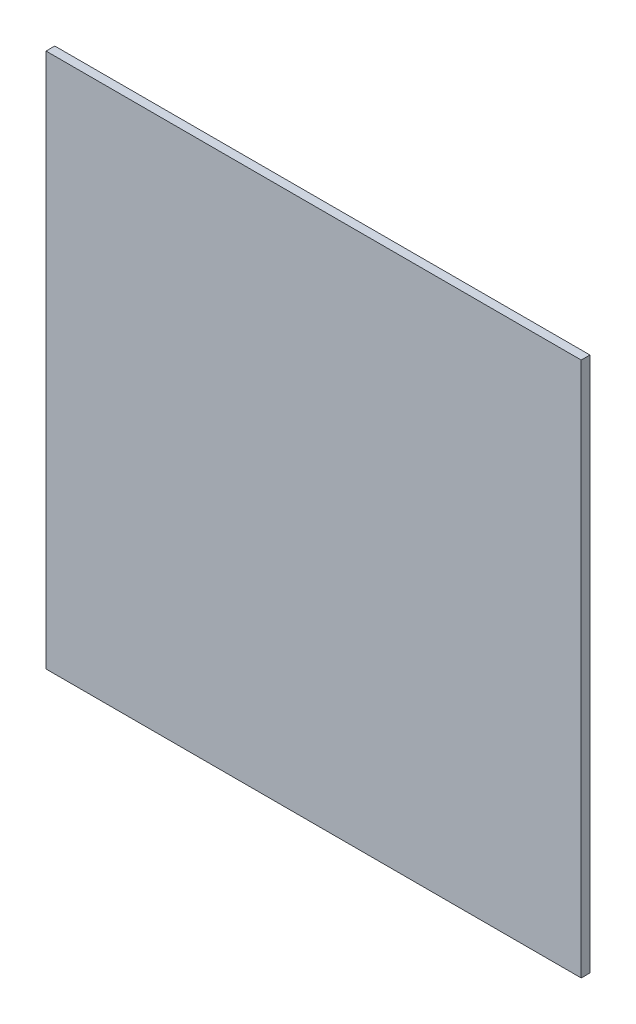
ISO-10303-21;
HEADER;
FILE_DESCRIPTION(('STEP AP214'),'2;1');
FILE_NAME('part.step','',(''),(''),'','','');
FILE_SCHEMA(('AUTOMOTIVE_DESIGN { 1 0 10303 214 1 1 1 1 }'));
ENDSEC;
DATA;
#1=APPLICATION_CONTEXT('core data for automotive mechanical design processes');
#2=APPLICATION_PROTOCOL_DEFINITION('international standard','automotive_design',2000,#1);
#3=PRODUCT_CONTEXT('',#1,'mechanical');
#4=PRODUCT('Part','Part','',(#3));
#5=PRODUCT_RELATED_PRODUCT_CATEGORY('part','',(#4));
#6=PRODUCT_DEFINITION_FORMATION('','',#4);
#7=PRODUCT_DEFINITION_CONTEXT('part definition',#1,'design');
#8=PRODUCT_DEFINITION('design','',#6,#7);
#9=PRODUCT_DEFINITION_SHAPE('','',#8);
#10=(LENGTH_UNIT() NAMED_UNIT(*) SI_UNIT(.MILLI.,.METRE.));
#11=(NAMED_UNIT(*) PLANE_ANGLE_UNIT() SI_UNIT($,.RADIAN.));
#12=(NAMED_UNIT(*) SI_UNIT($,.STERADIAN.) SOLID_ANGLE_UNIT());
#13=UNCERTAINTY_MEASURE_WITH_UNIT(LENGTH_MEASURE(1.E-05),#10,'distance_accuracy_value','');
#14=(GEOMETRIC_REPRESENTATION_CONTEXT(3) GLOBAL_UNCERTAINTY_ASSIGNED_CONTEXT((#13)) GLOBAL_UNIT_ASSIGNED_CONTEXT((#10,
#11,#12)) REPRESENTATION_CONTEXT('',''));
#15=CARTESIAN_POINT('',(0.,0.,0.));
#16=DIRECTION('',(0.,0.,1.));
#17=DIRECTION('',(1.,0.,0.));
#18=AXIS2_PLACEMENT_3D('',#15,#16,#17);
#19=CARTESIAN_POINT('',(0.,0.,1.6));
#20=DIRECTION('',(1.,0.,0.));
#21=DIRECTION('',(0.,0.,-1.));
#22=AXIS2_PLACEMENT_3D('',#19,#20,#21);
#23=PLANE('',#22);
#24=DIRECTION('',(0.,-1.,0.));
#25=VECTOR('',#24,1.);
#26=CARTESIAN_POINT('',(0.,0.,0.));
#27=LINE('',#26,#25);
#28=CARTESIAN_POINT('',(0.,98.,0.));
#29=VERTEX_POINT('',#28);
#30=CARTESIAN_POINT('',(0.,0.,0.));
#31=VERTEX_POINT('',#30);
#32=EDGE_CURVE('E102',#29,#31,#27,.T.);
#33=ORIENTED_EDGE('',*,*,#32,.T.);
#34=DIRECTION('',(0.,0.,-1.));
#35=VECTOR('',#34,1.);
#36=CARTESIAN_POINT('',(0.,0.,1.6));
#37=LINE('',#36,#35);
#38=CARTESIAN_POINT('',(0.,0.,1.6));
#39=VERTEX_POINT('',#38);
#40=EDGE_CURVE('E11',#39,#31,#37,.T.);
#41=ORIENTED_EDGE('',*,*,#40,.F.);
#42=DIRECTION('',(0.,-1.,0.));
#43=VECTOR('',#42,1.);
#44=CARTESIAN_POINT('',(0.,0.,1.6));
#45=LINE('',#44,#43);
#46=CARTESIAN_POINT('',(0.,98.,1.6));
#47=VERTEX_POINT('',#46);
#48=EDGE_CURVE('E90',#47,#39,#45,.T.);
#49=ORIENTED_EDGE('',*,*,#48,.F.);
#50=DIRECTION('',(0.,0.,-1.));
#51=VECTOR('',#50,1.);
#52=CARTESIAN_POINT('',(0.,98.,1.6));
#53=LINE('',#52,#51);
#54=EDGE_CURVE('E98',#47,#29,#53,.T.);
#55=ORIENTED_EDGE('',*,*,#54,.T.);
#56=EDGE_LOOP('',(#33,#41,#49,#55));
#57=FACE_BOUND('',#56,.T.);
#58=ADVANCED_FACE('F39',(#57),#23,.F.);
#59=CARTESIAN_POINT('',(0.,0.,1.6));
#60=DIRECTION('',(0.,1.,0.));
#61=DIRECTION('',(0.,0.,1.));
#62=AXIS2_PLACEMENT_3D('',#59,#60,#61);
#63=PLANE('',#62);
#64=DIRECTION('',(1.,0.,0.));
#65=VECTOR('',#64,1.);
#66=CARTESIAN_POINT('',(0.,0.,0.));
#67=LINE('',#66,#65);
#68=CARTESIAN_POINT('',(98.,0.,0.));
#69=VERTEX_POINT('',#68);
#70=EDGE_CURVE('E94',#31,#69,#67,.T.);
#71=ORIENTED_EDGE('',*,*,#70,.T.);
#72=DIRECTION('',(0.,0.,-1.));
#73=VECTOR('',#72,1.);
#74=CARTESIAN_POINT('',(98.,0.,1.6));
#75=LINE('',#74,#73);
#76=CARTESIAN_POINT('',(98.,0.,1.6));
#77=VERTEX_POINT('',#76);
#78=EDGE_CURVE('E47',#77,#69,#75,.T.);
#79=ORIENTED_EDGE('',*,*,#78,.F.);
#80=DIRECTION('',(1.,0.,0.));
#81=VECTOR('',#80,1.);
#82=CARTESIAN_POINT('',(0.,0.,1.6));
#83=LINE('',#82,#81);
#84=EDGE_CURVE('E85',#39,#77,#83,.T.);
#85=ORIENTED_EDGE('',*,*,#84,.F.);
#86=ORIENTED_EDGE('',*,*,#40,.T.);
#87=EDGE_LOOP('',(#71,#79,#85,#86));
#88=FACE_BOUND('',#87,.T.);
#89=ADVANCED_FACE('F93',(#88),#63,.F.);
#90=CARTESIAN_POINT('',(98.,0.,1.6));
#91=DIRECTION('',(-1.,0.,0.));
#92=DIRECTION('',(0.,0.,1.));
#93=AXIS2_PLACEMENT_3D('',#90,#91,#92);
#94=PLANE('',#93);
#95=DIRECTION('',(0.,1.,0.));
#96=VECTOR('',#95,1.);
#97=CARTESIAN_POINT('',(98.,0.,0.));
#98=LINE('',#97,#96);
#99=CARTESIAN_POINT('',(98.,98.,0.));
#100=VERTEX_POINT('',#99);
#101=EDGE_CURVE('E72',#69,#100,#98,.T.);
#102=ORIENTED_EDGE('',*,*,#101,.T.);
#103=DIRECTION('',(0.,0.,-1.));
#104=VECTOR('',#103,1.);
#105=CARTESIAN_POINT('',(98.,98.,1.6));
#106=LINE('',#105,#104);
#107=CARTESIAN_POINT('',(98.,98.,1.6));
#108=VERTEX_POINT('',#107);
#109=EDGE_CURVE('E95',#108,#100,#106,.T.);
#110=ORIENTED_EDGE('',*,*,#109,.F.);
#111=DIRECTION('',(0.,1.,0.));
#112=VECTOR('',#111,1.);
#113=CARTESIAN_POINT('',(98.,0.,1.6));
#114=LINE('',#113,#112);
#115=EDGE_CURVE('E88',#77,#108,#114,.T.);
#116=ORIENTED_EDGE('',*,*,#115,.F.);
#117=ORIENTED_EDGE('',*,*,#78,.T.);
#118=EDGE_LOOP('',(#102,#110,#116,#117));
#119=FACE_BOUND('',#118,.T.);
#120=ADVANCED_FACE('F96',(#119),#94,.F.);
#121=CARTESIAN_POINT('',(0.,98.,1.6));
#122=DIRECTION('',(0.,-1.,0.));
#123=DIRECTION('',(0.,0.,-1.));
#124=AXIS2_PLACEMENT_3D('',#121,#122,#123);
#125=PLANE('',#124);
#126=DIRECTION('',(-1.,0.,0.));
#127=VECTOR('',#126,1.);
#128=CARTESIAN_POINT('',(0.,98.,0.));
#129=LINE('',#128,#127);
#130=EDGE_CURVE('E78',#100,#29,#129,.T.);
#131=ORIENTED_EDGE('',*,*,#130,.T.);
#132=ORIENTED_EDGE('',*,*,#54,.F.);
#133=DIRECTION('',(-1.,0.,0.));
#134=VECTOR('',#133,1.);
#135=CARTESIAN_POINT('',(0.,98.,1.6));
#136=LINE('',#135,#134);
#137=EDGE_CURVE('E55',#108,#47,#136,.T.);
#138=ORIENTED_EDGE('',*,*,#137,.F.);
#139=ORIENTED_EDGE('',*,*,#109,.T.);
#140=EDGE_LOOP('',(#131,#132,#138,#139));
#141=FACE_BOUND('',#140,.T.);
#142=ADVANCED_FACE('F109',(#141),#125,.F.);
#143=CARTESIAN_POINT('',(0.,0.,1.6));
#144=DIRECTION('',(0.,0.,-1.));
#145=DIRECTION('',(-1.,0.,0.));
#146=AXIS2_PLACEMENT_3D('',#143,#144,#145);
#147=PLANE('',#146);
#148=ORIENTED_EDGE('',*,*,#48,.T.);
#149=ORIENTED_EDGE('',*,*,#84,.T.);
#150=ORIENTED_EDGE('',*,*,#115,.T.);
#151=ORIENTED_EDGE('',*,*,#137,.T.);
#152=EDGE_LOOP('',(#148,#149,#150,#151));
#153=FACE_BOUND('',#152,.T.);
#154=ADVANCED_FACE('F86',(#153),#147,.F.);
#155=CARTESIAN_POINT('',(0.,0.,0.));
#156=DIRECTION('',(0.,0.,-1.));
#157=DIRECTION('',(-1.,0.,0.));
#158=AXIS2_PLACEMENT_3D('',#155,#156,#157);
#159=PLANE('',#158);
#160=ORIENTED_EDGE('',*,*,#32,.F.);
#161=ORIENTED_EDGE('',*,*,#130,.F.);
#162=ORIENTED_EDGE('',*,*,#101,.F.);
#163=ORIENTED_EDGE('',*,*,#70,.F.);
#164=EDGE_LOOP('',(#160,#161,#162,#163));
#165=FACE_BOUND('',#164,.T.);
#166=ADVANCED_FACE('F112',(#165),#159,.T.);
#167=CLOSED_SHELL('',(#58,#89,#120,#142,#154,#166));
#168=MANIFOLD_SOLID_BREP('B2',#167);
#169=ADVANCED_BREP_SHAPE_REPRESENTATION('',(#18,#168),#14);
#170=SHAPE_DEFINITION_REPRESENTATION(#9,#169);
ENDSEC;
END-ISO-10303-21;
